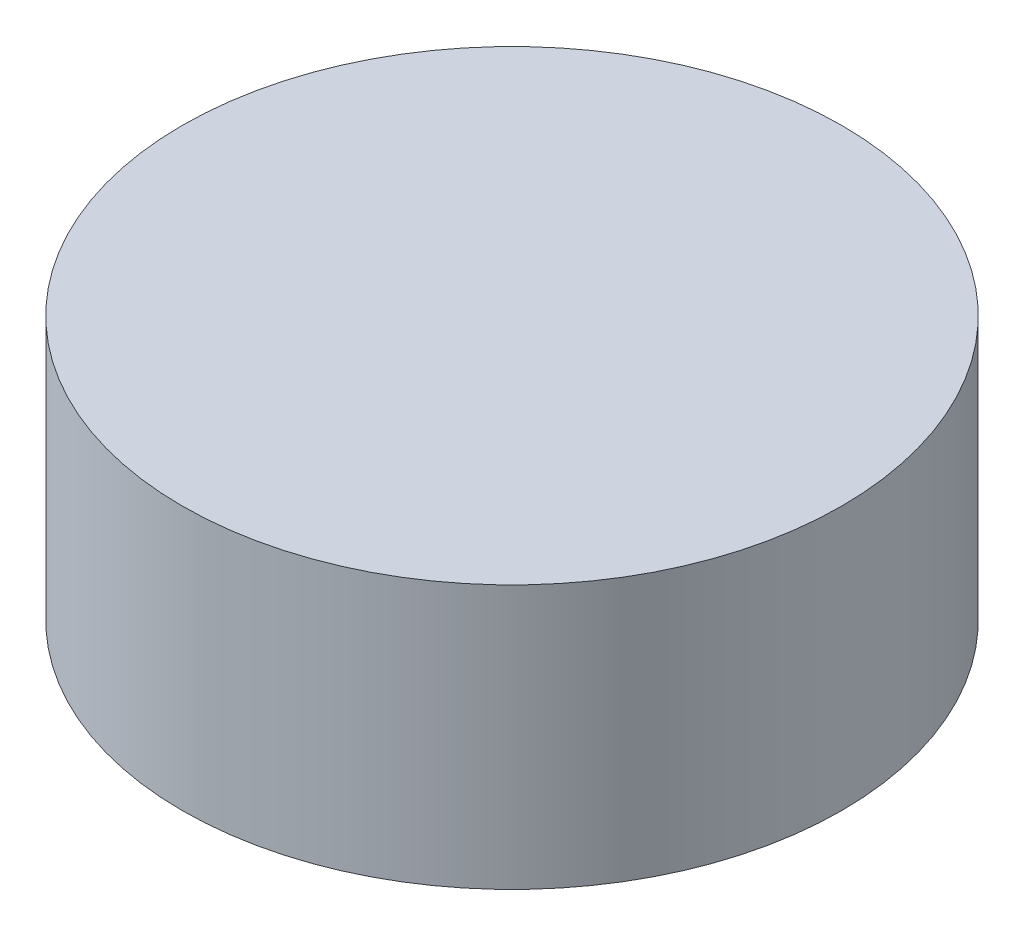
ISO-10303-21;
HEADER;
FILE_DESCRIPTION(('STEP AP214'),'2;1');
FILE_NAME('part.step','',(''),(''),'','','');
FILE_SCHEMA(('AUTOMOTIVE_DESIGN { 1 0 10303 214 1 1 1 1 }'));
ENDSEC;
DATA;
#1=APPLICATION_CONTEXT('core data for automotive mechanical design processes');
#2=APPLICATION_PROTOCOL_DEFINITION('international standard','automotive_design',2000,#1);
#3=PRODUCT_CONTEXT('',#1,'mechanical');
#4=PRODUCT('Part','Part','',(#3));
#5=PRODUCT_RELATED_PRODUCT_CATEGORY('part','',(#4));
#6=PRODUCT_DEFINITION_FORMATION('','',#4);
#7=PRODUCT_DEFINITION_CONTEXT('part definition',#1,'design');
#8=PRODUCT_DEFINITION('design','',#6,#7);
#9=PRODUCT_DEFINITION_SHAPE('','',#8);
#10=(LENGTH_UNIT() NAMED_UNIT(*) SI_UNIT(.MILLI.,.METRE.));
#11=(NAMED_UNIT(*) PLANE_ANGLE_UNIT() SI_UNIT($,.RADIAN.));
#12=(NAMED_UNIT(*) SI_UNIT($,.STERADIAN.) SOLID_ANGLE_UNIT());
#13=UNCERTAINTY_MEASURE_WITH_UNIT(LENGTH_MEASURE(1.E-05),#10,'distance_accuracy_value','');
#14=(GEOMETRIC_REPRESENTATION_CONTEXT(3) GLOBAL_UNCERTAINTY_ASSIGNED_CONTEXT((#13)) GLOBAL_UNIT_ASSIGNED_CONTEXT((#10,
#11,#12)) REPRESENTATION_CONTEXT('',''));
#15=CARTESIAN_POINT('',(0.,0.,0.));
#16=DIRECTION('',(0.,0.,1.));
#17=DIRECTION('',(1.,0.,0.));
#18=AXIS2_PLACEMENT_3D('',#15,#16,#17);
#19=CARTESIAN_POINT('',(0.,6.35,0.));
#20=DIRECTION('',(0.,-1.,0.));
#21=DIRECTION('',(0.,0.,-1.));
#22=AXIS2_PLACEMENT_3D('',#19,#20,#21);
#23=CYLINDRICAL_SURFACE('',#22,7.9375);
#24=CARTESIAN_POINT('',(0.,6.35,0.));
#25=DIRECTION('',(0.,1.,0.));
#26=DIRECTION('',(0.,0.,1.));
#27=AXIS2_PLACEMENT_3D('',#24,#25,#26);
#28=CIRCLE('',#27,7.9375);
#29=CARTESIAN_POINT('',(0.,6.35,7.9375));
#30=VERTEX_POINT('',#29);
#31=EDGE_CURVE('E10',#30,#30,#28,.T.);
#32=ORIENTED_EDGE('',*,*,#31,.F.);
#33=EDGE_LOOP('',(#32));
#34=FACE_BOUND('',#33,.T.);
#35=CARTESIAN_POINT('',(0.,0.,0.));
#36=DIRECTION('',(0.,1.,0.));
#37=DIRECTION('',(0.,0.,1.));
#38=AXIS2_PLACEMENT_3D('',#35,#36,#37);
#39=CIRCLE('',#38,7.9375);
#40=CARTESIAN_POINT('',(0.,0.,7.9375));
#41=VERTEX_POINT('',#40);
#42=EDGE_CURVE('E33',#41,#41,#39,.T.);
#43=ORIENTED_EDGE('',*,*,#42,.T.);
#44=EDGE_LOOP('',(#43));
#45=FACE_BOUND('',#44,.T.);
#46=ADVANCED_FACE('F30',(#34,#45),#23,.T.);
#47=CARTESIAN_POINT('',(0.,6.35,0.));
#48=DIRECTION('',(0.,1.,0.));
#49=DIRECTION('',(0.,0.,1.));
#50=AXIS2_PLACEMENT_3D('',#47,#48,#49);
#51=PLANE('',#50);
#52=ORIENTED_EDGE('',*,*,#31,.T.);
#53=EDGE_LOOP('',(#52));
#54=FACE_BOUND('',#53,.T.);
#55=ADVANCED_FACE('F45',(#54),#51,.T.);
#56=CARTESIAN_POINT('',(0.,0.,0.));
#57=DIRECTION('',(0.,1.,0.));
#58=DIRECTION('',(0.,0.,1.));
#59=AXIS2_PLACEMENT_3D('',#56,#57,#58);
#60=PLANE('',#59);
#61=ORIENTED_EDGE('',*,*,#42,.F.);
#62=EDGE_LOOP('',(#61));
#63=FACE_BOUND('',#62,.T.);
#64=ADVANCED_FACE('F43',(#63),#60,.F.);
#65=CLOSED_SHELL('',(#46,#55,#64));
#66=MANIFOLD_SOLID_BREP('B2',#65);
#67=ADVANCED_BREP_SHAPE_REPRESENTATION('',(#18,#66),#14);
#68=SHAPE_DEFINITION_REPRESENTATION(#9,#67);
ENDSEC;
END-ISO-10303-21;
